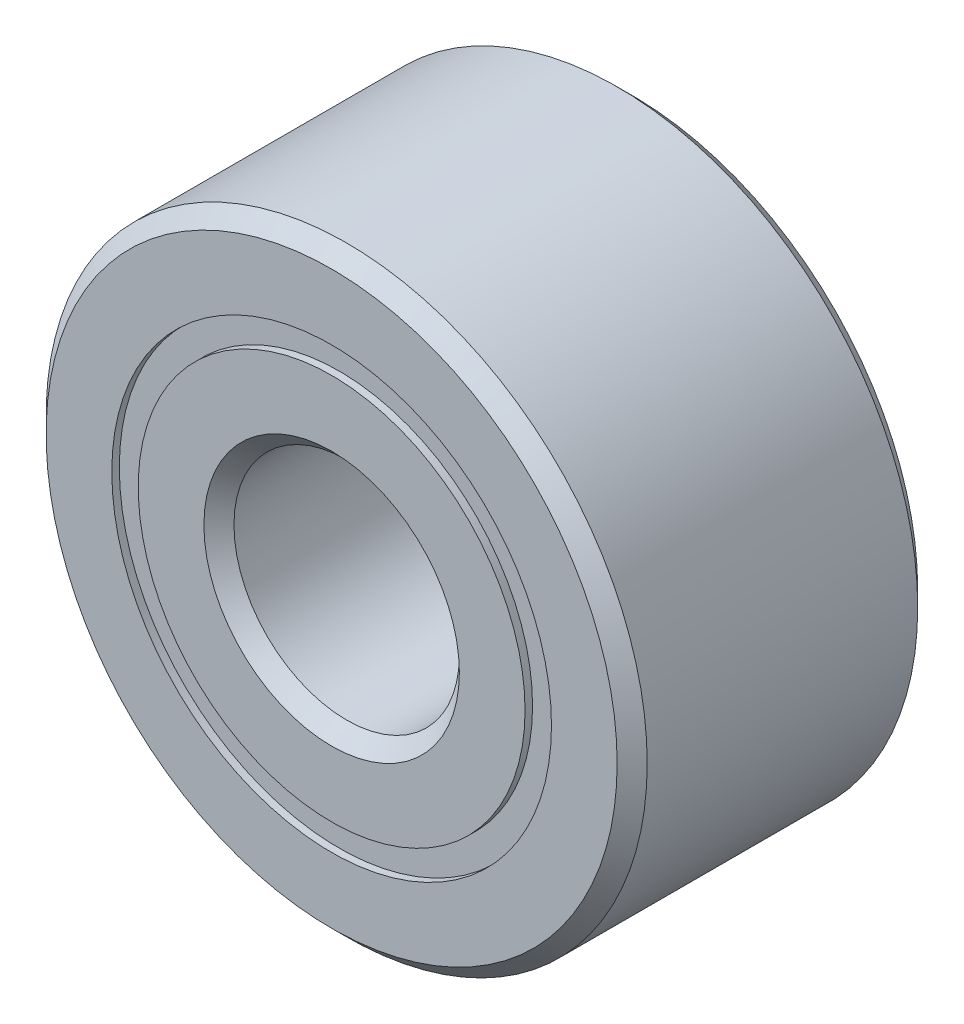
ISO-10303-21;
HEADER;
FILE_DESCRIPTION(('STEP AP214'),'2;1');
FILE_NAME('part.step','',(''),(''),'','','');
FILE_SCHEMA(('AUTOMOTIVE_DESIGN { 1 0 10303 214 1 1 1 1 }'));
ENDSEC;
DATA;
#1=APPLICATION_CONTEXT('core data for automotive mechanical design processes');
#2=APPLICATION_PROTOCOL_DEFINITION('international standard','automotive_design',2000,#1);
#3=PRODUCT_CONTEXT('',#1,'mechanical');
#4=PRODUCT('Part','Part','',(#3));
#5=PRODUCT_RELATED_PRODUCT_CATEGORY('part','',(#4));
#6=PRODUCT_DEFINITION_FORMATION('','',#4);
#7=PRODUCT_DEFINITION_CONTEXT('part definition',#1,'design');
#8=PRODUCT_DEFINITION('design','',#6,#7);
#9=PRODUCT_DEFINITION_SHAPE('','',#8);
#10=(LENGTH_UNIT() NAMED_UNIT(*) SI_UNIT(.MILLI.,.METRE.));
#11=(NAMED_UNIT(*) PLANE_ANGLE_UNIT() SI_UNIT($,.RADIAN.));
#12=(NAMED_UNIT(*) SI_UNIT($,.STERADIAN.) SOLID_ANGLE_UNIT());
#13=UNCERTAINTY_MEASURE_WITH_UNIT(LENGTH_MEASURE(1.E-05),#10,'distance_accuracy_value','');
#14=(GEOMETRIC_REPRESENTATION_CONTEXT(3) GLOBAL_UNCERTAINTY_ASSIGNED_CONTEXT((#13)) GLOBAL_UNIT_ASSIGNED_CONTEXT((#10,
#11,#12)) REPRESENTATION_CONTEXT('',''));
#15=CARTESIAN_POINT('',(0.,0.,0.));
#16=DIRECTION('',(0.,0.,1.));
#17=DIRECTION('',(1.,0.,0.));
#18=AXIS2_PLACEMENT_3D('',#15,#16,#17);
#19=CARTESIAN_POINT('',(0.,2.92582417582418,-1.9));
#20=DIRECTION('',(0.,0.,1.));
#21=DIRECTION('',(1.,0.,0.));
#22=AXIS2_PLACEMENT_3D('',#19,#20,#21);
#23=PLANE('',#22);
#24=CARTESIAN_POINT('',(0.,0.,-1.9));
#25=DIRECTION('',(0.,0.,1.));
#26=DIRECTION('',(1.,0.,0.));
#27=AXIS2_PLACEMENT_3D('',#24,#25,#26);
#28=CIRCLE('',#27,2.92582417582418);
#29=CARTESIAN_POINT('',(2.92582417582418,0.,-1.9));
#30=VERTEX_POINT('',#29);
#31=EDGE_CURVE('E55',#30,#30,#28,.T.);
#32=ORIENTED_EDGE('',*,*,#31,.F.);
#33=EDGE_LOOP('',(#32));
#34=FACE_BOUND('',#33,.T.);
#35=CARTESIAN_POINT('',(0.,0.,-1.9));
#36=DIRECTION('',(0.,0.,1.));
#37=DIRECTION('',(1.,0.,0.));
#38=AXIS2_PLACEMENT_3D('',#35,#36,#37);
#39=CIRCLE('',#38,2.57417582417583);
#40=CARTESIAN_POINT('',(2.57417582417583,0.,-1.9));
#41=VERTEX_POINT('',#40);
#42=EDGE_CURVE('E11',#41,#41,#39,.T.);
#43=ORIENTED_EDGE('',*,*,#42,.T.);
#44=EDGE_LOOP('',(#43));
#45=FACE_BOUND('',#44,.T.);
#46=ADVANCED_FACE('F41',(#34,#45),#23,.F.);
#47=CARTESIAN_POINT('',(0.,0.,2.));
#48=DIRECTION('',(0.,0.,1.));
#49=DIRECTION('',(1.,0.,0.));
#50=AXIS2_PLACEMENT_3D('',#47,#48,#49);
#51=CYLINDRICAL_SURFACE('',#50,2.57417582417583);
#52=ORIENTED_EDGE('',*,*,#42,.F.);
#53=EDGE_LOOP('',(#52));
#54=FACE_BOUND('',#53,.T.);
#55=CARTESIAN_POINT('',(0.,0.,-0.90611125012019));
#56=DIRECTION('',(0.,0.,1.));
#57=DIRECTION('',(1.,0.,0.));
#58=AXIS2_PLACEMENT_3D('',#55,#56,#57);
#59=CIRCLE('',#58,2.57417582417583);
#60=CARTESIAN_POINT('',(2.57417582417583,0.,-0.90611125012019));
#61=VERTEX_POINT('',#60);
#62=EDGE_CURVE('E47',#61,#61,#59,.T.);
#63=ORIENTED_EDGE('',*,*,#62,.T.);
#64=EDGE_LOOP('',(#63));
#65=FACE_BOUND('',#64,.T.);
#66=ADVANCED_FACE('F64',(#54,#65),#51,.F.);
#67=CARTESIAN_POINT('',(0.,2.92582417582418,-0.90611125012019));
#68=DIRECTION('',(0.,0.,-1.));
#69=DIRECTION('',(-1.,0.,0.));
#70=AXIS2_PLACEMENT_3D('',#67,#68,#69);
#71=PLANE('',#70);
#72=ORIENTED_EDGE('',*,*,#62,.F.);
#73=EDGE_LOOP('',(#72));
#74=FACE_BOUND('',#73,.T.);
#75=CARTESIAN_POINT('',(0.,0.,-0.90611125012019));
#76=DIRECTION('',(0.,0.,1.));
#77=DIRECTION('',(1.,0.,0.));
#78=AXIS2_PLACEMENT_3D('',#75,#76,#77);
#79=CIRCLE('',#78,2.92582417582418);
#80=CARTESIAN_POINT('',(2.92582417582418,0.,-0.90611125012019));
#81=VERTEX_POINT('',#80);
#82=EDGE_CURVE('E51',#81,#81,#79,.T.);
#83=ORIENTED_EDGE('',*,*,#82,.T.);
#84=EDGE_LOOP('',(#83));
#85=FACE_BOUND('',#84,.T.);
#86=ADVANCED_FACE('F68',(#74,#85),#71,.F.);
#87=CARTESIAN_POINT('',(0.,0.,2.));
#88=DIRECTION('',(0.,0.,1.));
#89=DIRECTION('',(1.,0.,0.));
#90=AXIS2_PLACEMENT_3D('',#87,#88,#89);
#91=CYLINDRICAL_SURFACE('',#90,2.92582417582418);
#92=ORIENTED_EDGE('',*,*,#82,.F.);
#93=EDGE_LOOP('',(#92));
#94=FACE_BOUND('',#93,.T.);
#95=ORIENTED_EDGE('',*,*,#31,.T.);
#96=EDGE_LOOP('',(#95));
#97=FACE_BOUND('',#96,.T.);
#98=ADVANCED_FACE('F61',(#94,#97),#91,.T.);
#99=CLOSED_SHELL('',(#46,#66,#86,#98));
#100=MANIFOLD_SOLID_BREP('B2',#99);
#101=CARTESIAN_POINT('',(0.,2.92582417582418,1.9));
#102=DIRECTION('',(0.,0.,-1.));
#103=DIRECTION('',(-1.,0.,0.));
#104=AXIS2_PLACEMENT_3D('',#101,#102,#103);
#105=PLANE('',#104);
#106=CARTESIAN_POINT('',(0.,0.,1.9));
#107=DIRECTION('',(0.,0.,1.));
#108=DIRECTION('',(1.,0.,0.));
#109=AXIS2_PLACEMENT_3D('',#106,#107,#108);
#110=CIRCLE('',#109,2.57417582417583);
#111=CARTESIAN_POINT('',(2.57417582417583,0.,1.9));
#112=VERTEX_POINT('',#111);
#113=EDGE_CURVE('E40',#112,#112,#110,.T.);
#114=ORIENTED_EDGE('',*,*,#113,.F.);
#115=EDGE_LOOP('',(#114));
#116=FACE_BOUND('',#115,.T.);
#117=CARTESIAN_POINT('',(0.,0.,1.9));
#118=DIRECTION('',(0.,0.,1.));
#119=DIRECTION('',(1.,0.,0.));
#120=AXIS2_PLACEMENT_3D('',#117,#118,#119);
#121=CIRCLE('',#120,2.92582417582418);
#122=CARTESIAN_POINT('',(2.92582417582418,0.,1.9));
#123=VERTEX_POINT('',#122);
#124=EDGE_CURVE('E122',#123,#123,#121,.T.);
#125=ORIENTED_EDGE('',*,*,#124,.T.);
#126=EDGE_LOOP('',(#125));
#127=FACE_BOUND('',#126,.T.);
#128=ADVANCED_FACE('F108',(#116,#127),#105,.F.);
#129=CARTESIAN_POINT('',(0.,0.,2.));
#130=DIRECTION('',(0.,0.,1.));
#131=DIRECTION('',(1.,0.,0.));
#132=AXIS2_PLACEMENT_3D('',#129,#130,#131);
#133=CYLINDRICAL_SURFACE('',#132,2.57417582417583);
#134=CARTESIAN_POINT('',(0.,0.,0.90611125012019));
#135=DIRECTION('',(0.,0.,1.));
#136=DIRECTION('',(1.,0.,0.));
#137=AXIS2_PLACEMENT_3D('',#134,#135,#136);
#138=CIRCLE('',#137,2.57417582417583);
#139=CARTESIAN_POINT('',(2.57417582417583,0.,0.90611125012019));
#140=VERTEX_POINT('',#139);
#141=EDGE_CURVE('E114',#140,#140,#138,.T.);
#142=ORIENTED_EDGE('',*,*,#141,.F.);
#143=EDGE_LOOP('',(#142));
#144=FACE_BOUND('',#143,.T.);
#145=ORIENTED_EDGE('',*,*,#113,.T.);
#146=EDGE_LOOP('',(#145));
#147=FACE_BOUND('',#146,.T.);
#148=ADVANCED_FACE('F137',(#144,#147),#133,.F.);
#149=CARTESIAN_POINT('',(0.,2.92582417582418,0.90611125012019));
#150=DIRECTION('',(0.,0.,1.));
#151=DIRECTION('',(1.,0.,0.));
#152=AXIS2_PLACEMENT_3D('',#149,#150,#151);
#153=PLANE('',#152);
#154=CARTESIAN_POINT('',(0.,0.,0.90611125012019));
#155=DIRECTION('',(0.,0.,1.));
#156=DIRECTION('',(1.,0.,0.));
#157=AXIS2_PLACEMENT_3D('',#154,#155,#156);
#158=CIRCLE('',#157,2.92582417582418);
#159=CARTESIAN_POINT('',(2.92582417582418,0.,0.90611125012019));
#160=VERTEX_POINT('',#159);
#161=EDGE_CURVE('E118',#160,#160,#158,.T.);
#162=ORIENTED_EDGE('',*,*,#161,.F.);
#163=EDGE_LOOP('',(#162));
#164=FACE_BOUND('',#163,.T.);
#165=ORIENTED_EDGE('',*,*,#141,.T.);
#166=EDGE_LOOP('',(#165));
#167=FACE_BOUND('',#166,.T.);
#168=ADVANCED_FACE('F132',(#164,#167),#153,.F.);
#169=CARTESIAN_POINT('',(0.,0.,2.));
#170=DIRECTION('',(0.,0.,1.));
#171=DIRECTION('',(1.,0.,0.));
#172=AXIS2_PLACEMENT_3D('',#169,#170,#171);
#173=CYLINDRICAL_SURFACE('',#172,2.92582417582418);
#174=ORIENTED_EDGE('',*,*,#124,.F.);
#175=EDGE_LOOP('',(#174));
#176=FACE_BOUND('',#175,.T.);
#177=ORIENTED_EDGE('',*,*,#161,.T.);
#178=EDGE_LOOP('',(#177));
#179=FACE_BOUND('',#178,.T.);
#180=ADVANCED_FACE('F129',(#176,#179),#173,.T.);
#181=CLOSED_SHELL('',(#128,#148,#168,#180));
#182=MANIFOLD_SOLID_BREP('B6',#181);
#183=CARTESIAN_POINT('',(-1.37499999999997,2.38156986040722,0.));
#184=DIRECTION('',(0.,0.,1.));
#185=DIRECTION('',(-0.499999999999989,0.866025403784445,0.));
#186=AXIS2_PLACEMENT_3D('',#183,#184,#185);
#187=SPHERICAL_SURFACE('',#186,0.90611125012019);
#188=CARTESIAN_POINT('',(-1.37499999999997,2.38156986040722,0.90611125012019));
#189=VERTEX_POINT('',#188);
#190=VERTEX_LOOP('',#189);
#191=FACE_BOUND('',#190,.T.);
#192=ADVANCED_FACE('F175',(#191),#187,.T.);
#193=CLOSED_SHELL('',(#192));
#194=MANIFOLD_SOLID_BREP('B35',#193);
#195=CARTESIAN_POINT('',(-2.38156986040719,1.37500000000003,0.));
#196=DIRECTION('',(0.,0.,1.));
#197=DIRECTION('',(-0.866025403784433,0.50000000000001,0.));
#198=AXIS2_PLACEMENT_3D('',#195,#196,#197);
#199=SPHERICAL_SURFACE('',#198,0.90611125012019);
#200=CARTESIAN_POINT('',(-2.38156986040719,1.37500000000003,0.90611125012019));
#201=VERTEX_POINT('',#200);
#202=VERTEX_LOOP('',#201);
#203=FACE_BOUND('',#202,.T.);
#204=ADVANCED_FACE('F195',(#203),#199,.T.);
#205=CLOSED_SHELL('',(#204));
#206=MANIFOLD_SOLID_BREP('B104',#205);
#207=CARTESIAN_POINT('',(-2.75,0.,0.));
#208=DIRECTION('',(0.,0.,1.));
#209=DIRECTION('',(-1.,0.,0.));
#210=AXIS2_PLACEMENT_3D('',#207,#208,#209);
#211=SPHERICAL_SURFACE('',#210,0.90611125012019);
#212=CARTESIAN_POINT('',(-2.75,0.,0.90611125012019));
#213=VERTEX_POINT('',#212);
#214=VERTEX_LOOP('',#213);
#215=FACE_BOUND('',#214,.T.);
#216=ADVANCED_FACE('F215',(#215),#211,.T.);
#217=CLOSED_SHELL('',(#216));
#218=MANIFOLD_SOLID_BREP('B171',#217);
#219=CARTESIAN_POINT('',(-2.38156986040722,-1.37499999999998,0.));
#220=DIRECTION('',(0.,0.,1.));
#221=DIRECTION('',(-0.866025403784443,-0.499999999999992,0.));
#222=AXIS2_PLACEMENT_3D('',#219,#220,#221);
#223=SPHERICAL_SURFACE('',#222,0.90611125012019);
#224=CARTESIAN_POINT('',(-2.38156986040722,-1.37499999999998,0.90611125012019));
#225=VERTEX_POINT('',#224);
#226=VERTEX_LOOP('',#225);
#227=FACE_BOUND('',#226,.T.);
#228=ADVANCED_FACE('F235',(#227),#223,.T.);
#229=CLOSED_SHELL('',(#228));
#230=MANIFOLD_SOLID_BREP('B191',#229);
#231=CARTESIAN_POINT('',(-1.37500000000002,-2.3815698604072,0.));
#232=DIRECTION('',(0.,0.,1.));
#233=DIRECTION('',(-0.500000000000007,-0.866025403784435,0.));
#234=AXIS2_PLACEMENT_3D('',#231,#232,#233);
#235=SPHERICAL_SURFACE('',#234,0.90611125012019);
#236=CARTESIAN_POINT('',(-1.37500000000002,-2.3815698604072,0.90611125012019));
#237=VERTEX_POINT('',#236);
#238=VERTEX_LOOP('',#237);
#239=FACE_BOUND('',#238,.T.);
#240=ADVANCED_FACE('F255',(#239),#235,.T.);
#241=CLOSED_SHELL('',(#240));
#242=MANIFOLD_SOLID_BREP('B211',#241);
#243=CARTESIAN_POINT('',(0.,-2.75,0.));
#244=DIRECTION('',(0.,0.,1.));
#245=DIRECTION('',(0.,-1.,0.));
#246=AXIS2_PLACEMENT_3D('',#243,#244,#245);
#247=SPHERICAL_SURFACE('',#246,0.90611125012019);
#248=CARTESIAN_POINT('',(0.,-2.75,0.90611125012019));
#249=VERTEX_POINT('',#248);
#250=VERTEX_LOOP('',#249);
#251=FACE_BOUND('',#250,.T.);
#252=ADVANCED_FACE('F275',(#251),#247,.T.);
#253=CLOSED_SHELL('',(#252));
#254=MANIFOLD_SOLID_BREP('B231',#253);
#255=CARTESIAN_POINT('',(1.37499999999999,-2.38156986040721,0.));
#256=DIRECTION('',(0.,0.,1.));
#257=DIRECTION('',(0.499999999999995,-0.866025403784442,0.));
#258=AXIS2_PLACEMENT_3D('',#255,#256,#257);
#259=SPHERICAL_SURFACE('',#258,0.90611125012019);
#260=CARTESIAN_POINT('',(1.37499999999999,-2.38156986040721,0.90611125012019));
#261=VERTEX_POINT('',#260);
#262=VERTEX_LOOP('',#261);
#263=FACE_BOUND('',#262,.T.);
#264=ADVANCED_FACE('F295',(#263),#259,.T.);
#265=CLOSED_SHELL('',(#264));
#266=MANIFOLD_SOLID_BREP('B251',#265);
#267=CARTESIAN_POINT('',(2.3815698604072,-1.37500000000001,0.));
#268=DIRECTION('',(0.,0.,1.));
#269=DIRECTION('',(0.866025403784436,-0.500000000000004,0.));
#270=AXIS2_PLACEMENT_3D('',#267,#268,#269);
#271=SPHERICAL_SURFACE('',#270,0.90611125012019);
#272=CARTESIAN_POINT('',(2.3815698604072,-1.37500000000001,0.90611125012019));
#273=VERTEX_POINT('',#272);
#274=VERTEX_LOOP('',#273);
#275=FACE_BOUND('',#274,.T.);
#276=ADVANCED_FACE('F315',(#275),#271,.T.);
#277=CLOSED_SHELL('',(#276));
#278=MANIFOLD_SOLID_BREP('B271',#277);
#279=CARTESIAN_POINT('',(2.75,0.,0.));
#280=DIRECTION('',(0.,0.,1.));
#281=DIRECTION('',(1.,0.,0.));
#282=AXIS2_PLACEMENT_3D('',#279,#280,#281);
#283=SPHERICAL_SURFACE('',#282,0.90611125012019);
#284=CARTESIAN_POINT('',(2.75,0.,0.90611125012019));
#285=VERTEX_POINT('',#284);
#286=VERTEX_LOOP('',#285);
#287=FACE_BOUND('',#286,.T.);
#288=ADVANCED_FACE('F335',(#287),#283,.T.);
#289=CLOSED_SHELL('',(#288));
#290=MANIFOLD_SOLID_BREP('B291',#289);
#291=CARTESIAN_POINT('',(2.38156986040721,1.37499999999999,0.));
#292=DIRECTION('',(0.,0.,1.));
#293=DIRECTION('',(0.86602540378444,0.499999999999998,0.));
#294=AXIS2_PLACEMENT_3D('',#291,#292,#293);
#295=SPHERICAL_SURFACE('',#294,0.90611125012019);
#296=CARTESIAN_POINT('',(2.38156986040721,1.37499999999999,0.90611125012019));
#297=VERTEX_POINT('',#296);
#298=VERTEX_LOOP('',#297);
#299=FACE_BOUND('',#298,.T.);
#300=ADVANCED_FACE('F355',(#299),#295,.T.);
#301=CLOSED_SHELL('',(#300));
#302=MANIFOLD_SOLID_BREP('B311',#301);
#303=CARTESIAN_POINT('',(1.375,2.3815698604072,0.));
#304=DIRECTION('',(0.,0.,1.));
#305=DIRECTION('',(0.500000000000001,0.866025403784438,0.));
#306=AXIS2_PLACEMENT_3D('',#303,#304,#305);
#307=SPHERICAL_SURFACE('',#306,0.90611125012019);
#308=CARTESIAN_POINT('',(1.375,2.3815698604072,0.90611125012019));
#309=VERTEX_POINT('',#308);
#310=VERTEX_LOOP('',#309);
#311=FACE_BOUND('',#310,.T.);
#312=ADVANCED_FACE('F375',(#311),#307,.T.);
#313=CLOSED_SHELL('',(#312));
#314=MANIFOLD_SOLID_BREP('B331',#313);
#315=CARTESIAN_POINT('',(0.,2.75,0.));
#316=DIRECTION('',(0.,0.,1.));
#317=DIRECTION('',(0.,1.,0.));
#318=AXIS2_PLACEMENT_3D('',#315,#316,#317);
#319=SPHERICAL_SURFACE('',#318,0.90611125012019);
#320=CARTESIAN_POINT('',(0.,2.75,0.90611125012019));
#321=VERTEX_POINT('',#320);
#322=VERTEX_LOOP('',#321);
#323=FACE_BOUND('',#322,.T.);
#324=ADVANCED_FACE('F397',(#323),#319,.T.);
#325=CLOSED_SHELL('',(#324));
#326=MANIFOLD_SOLID_BREP('B351',#325);
#327=CARTESIAN_POINT('',(0.,2.57417582417583,2.));
#328=DIRECTION('',(0.,0.,-1.));
#329=DIRECTION('',(-1.,0.,0.));
#330=AXIS2_PLACEMENT_3D('',#327,#328,#329);
#331=PLANE('',#330);
#332=CARTESIAN_POINT('',(0.,0.,2.));
#333=DIRECTION('',(0.,0.,1.));
#334=DIRECTION('',(1.,0.,0.));
#335=AXIS2_PLACEMENT_3D('',#332,#333,#334);
#336=CIRCLE('',#335,1.7);
#337=CARTESIAN_POINT('',(1.7,0.,2.));
#338=VERTEX_POINT('',#337);
#339=EDGE_CURVE('E444',#338,#338,#336,.T.);
#340=ORIENTED_EDGE('',*,*,#339,.F.);
#341=EDGE_LOOP('',(#340));
#342=FACE_BOUND('',#341,.T.);
#343=CARTESIAN_POINT('',(0.,0.,2.));
#344=DIRECTION('',(0.,0.,1.));
#345=DIRECTION('',(1.,0.,0.));
#346=AXIS2_PLACEMENT_3D('',#343,#344,#345);
#347=CIRCLE('',#346,2.57417582417583);
#348=CARTESIAN_POINT('',(2.57417582417583,0.,2.));
#349=VERTEX_POINT('',#348);
#350=EDGE_CURVE('E396',#349,#349,#347,.T.);
#351=ORIENTED_EDGE('',*,*,#350,.T.);
#352=EDGE_LOOP('',(#351));
#353=FACE_BOUND('',#352,.T.);
#354=ADVANCED_FACE('F416',(#342,#353),#331,.F.);
#355=CARTESIAN_POINT('',(0.,0.,2.));
#356=DIRECTION('',(0.,0.,1.));
#357=DIRECTION('',(1.,0.,0.));
#358=AXIS2_PLACEMENT_3D('',#355,#356,#357);
#359=CYLINDRICAL_SURFACE('',#358,2.57417582417583);
#360=ORIENTED_EDGE('',*,*,#350,.F.);
#361=EDGE_LOOP('',(#360));
#362=FACE_BOUND('',#361,.T.);
#363=CARTESIAN_POINT('',(0.,0.,0.888888888888889));
#364=DIRECTION('',(0.,0.,1.));
#365=DIRECTION('',(1.,0.,0.));
#366=AXIS2_PLACEMENT_3D('',#363,#364,#365);
#367=CIRCLE('',#366,2.57417582417583);
#368=CARTESIAN_POINT('',(2.57417582417583,0.,0.888888888888889));
#369=VERTEX_POINT('',#368);
#370=EDGE_CURVE('E422',#369,#369,#367,.T.);
#371=ORIENTED_EDGE('',*,*,#370,.T.);
#372=EDGE_LOOP('',(#371));
#373=FACE_BOUND('',#372,.T.);
#374=ADVANCED_FACE('F451',(#362,#373),#359,.T.);
#375=CARTESIAN_POINT('',(0.,0.,0.));
#376=DIRECTION('',(0.,0.,1.));
#377=DIRECTION('',(1.,0.,0.));
#378=AXIS2_PLACEMENT_3D('',#375,#376,#377);
#379=TOROIDAL_SURFACE('',#378,2.75,0.906111250120189);
#380=ORIENTED_EDGE('',*,*,#370,.F.);
#381=EDGE_LOOP('',(#380));
#382=FACE_BOUND('',#381,.T.);
#383=CARTESIAN_POINT('',(0.,0.,-0.88888888888889));
#384=DIRECTION('',(0.,0.,1.));
#385=DIRECTION('',(1.,0.,0.));
#386=AXIS2_PLACEMENT_3D('',#383,#384,#385);
#387=CIRCLE('',#386,2.57417582417583);
#388=CARTESIAN_POINT('',(2.57417582417583,0.,-0.88888888888889));
#389=VERTEX_POINT('',#388);
#390=EDGE_CURVE('E426',#389,#389,#387,.T.);
#391=ORIENTED_EDGE('',*,*,#390,.T.);
#392=EDGE_LOOP('',(#391));
#393=FACE_BOUND('',#392,.T.);
#394=ADVANCED_FACE('F455',(#382,#393),#379,.F.);
#395=CARTESIAN_POINT('',(0.,0.,2.));
#396=DIRECTION('',(0.,0.,1.));
#397=DIRECTION('',(1.,0.,0.));
#398=AXIS2_PLACEMENT_3D('',#395,#396,#397);
#399=CYLINDRICAL_SURFACE('',#398,2.57417582417583);
#400=ORIENTED_EDGE('',*,*,#390,.F.);
#401=EDGE_LOOP('',(#400));
#402=FACE_BOUND('',#401,.T.);
#403=CARTESIAN_POINT('',(0.,0.,-2.));
#404=DIRECTION('',(0.,0.,1.));
#405=DIRECTION('',(1.,0.,0.));
#406=AXIS2_PLACEMENT_3D('',#403,#404,#405);
#407=CIRCLE('',#406,2.57417582417583);
#408=CARTESIAN_POINT('',(2.57417582417583,0.,-2.));
#409=VERTEX_POINT('',#408);
#410=EDGE_CURVE('E430',#409,#409,#407,.T.);
#411=ORIENTED_EDGE('',*,*,#410,.T.);
#412=EDGE_LOOP('',(#411));
#413=FACE_BOUND('',#412,.T.);
#414=ADVANCED_FACE('F460',(#402,#413),#399,.T.);
#415=CARTESIAN_POINT('',(0.,1.7,-2.));
#416=DIRECTION('',(0.,0.,1.));
#417=DIRECTION('',(1.,0.,0.));
#418=AXIS2_PLACEMENT_3D('',#415,#416,#417);
#419=PLANE('',#418);
#420=ORIENTED_EDGE('',*,*,#410,.F.);
#421=EDGE_LOOP('',(#420));
#422=FACE_BOUND('',#421,.T.);
#423=CARTESIAN_POINT('',(0.,0.,-2.));
#424=DIRECTION('',(0.,0.,1.));
#425=DIRECTION('',(1.,0.,0.));
#426=AXIS2_PLACEMENT_3D('',#423,#424,#425);
#427=CIRCLE('',#426,1.7);
#428=CARTESIAN_POINT('',(1.7,0.,-2.));
#429=VERTEX_POINT('',#428);
#430=EDGE_CURVE('E435',#429,#429,#427,.T.);
#431=ORIENTED_EDGE('',*,*,#430,.T.);
#432=EDGE_LOOP('',(#431));
#433=FACE_BOUND('',#432,.T.);
#434=ADVANCED_FACE('F466',(#422,#433),#419,.F.);
#435=CARTESIAN_POINT('',(0.,0.,-1.8));
#436=DIRECTION('',(0.,0.,-1.));
#437=DIRECTION('',(-1.,0.,0.));
#438=AXIS2_PLACEMENT_3D('',#435,#436,#437);
#439=CONICAL_SURFACE('',#438,1.5,0.785398163397443);
#440=ORIENTED_EDGE('',*,*,#430,.F.);
#441=EDGE_LOOP('',(#440));
#442=FACE_BOUND('',#441,.T.);
#443=CARTESIAN_POINT('',(0.,0.,-1.8));
#444=DIRECTION('',(0.,0.,1.));
#445=DIRECTION('',(1.,0.,0.));
#446=AXIS2_PLACEMENT_3D('',#443,#444,#445);
#447=CIRCLE('',#446,1.5);
#448=CARTESIAN_POINT('',(1.5,0.,-1.8));
#449=VERTEX_POINT('',#448);
#450=EDGE_CURVE('E438',#449,#449,#447,.T.);
#451=ORIENTED_EDGE('',*,*,#450,.T.);
#452=EDGE_LOOP('',(#451));
#453=FACE_BOUND('',#452,.T.);
#454=ADVANCED_FACE('F470',(#442,#453),#439,.F.);
#455=CARTESIAN_POINT('',(0.,0.,2.));
#456=DIRECTION('',(0.,0.,1.));
#457=DIRECTION('',(1.,0.,0.));
#458=AXIS2_PLACEMENT_3D('',#455,#456,#457);
#459=CYLINDRICAL_SURFACE('',#458,1.5);
#460=ORIENTED_EDGE('',*,*,#450,.F.);
#461=EDGE_LOOP('',(#460));
#462=FACE_BOUND('',#461,.T.);
#463=CARTESIAN_POINT('',(0.,0.,1.8));
#464=DIRECTION('',(0.,0.,1.));
#465=DIRECTION('',(1.,0.,0.));
#466=AXIS2_PLACEMENT_3D('',#463,#464,#465);
#467=CIRCLE('',#466,1.5);
#468=CARTESIAN_POINT('',(1.5,0.,1.8));
#469=VERTEX_POINT('',#468);
#470=EDGE_CURVE('E441',#469,#469,#467,.T.);
#471=ORIENTED_EDGE('',*,*,#470,.T.);
#472=EDGE_LOOP('',(#471));
#473=FACE_BOUND('',#472,.T.);
#474=ADVANCED_FACE('F474',(#462,#473),#459,.F.);
#475=CARTESIAN_POINT('',(0.,0.,2.));
#476=DIRECTION('',(0.,0.,1.));
#477=DIRECTION('',(1.,0.,0.));
#478=AXIS2_PLACEMENT_3D('',#475,#476,#477);
#479=CONICAL_SURFACE('',#478,1.7,0.785398163397454);
#480=ORIENTED_EDGE('',*,*,#470,.F.);
#481=EDGE_LOOP('',(#480));
#482=FACE_BOUND('',#481,.T.);
#483=ORIENTED_EDGE('',*,*,#339,.T.);
#484=EDGE_LOOP('',(#483));
#485=FACE_BOUND('',#484,.T.);
#486=ADVANCED_FACE('F448',(#482,#485),#479,.F.);
#487=CLOSED_SHELL('',(#354,#374,#394,#414,#434,#454,#474,#486));
#488=MANIFOLD_SOLID_BREP('B371',#487);
#489=CARTESIAN_POINT('',(0.,0.,1.8));
#490=DIRECTION('',(0.,0.,-1.));
#491=DIRECTION('',(-1.,0.,0.));
#492=AXIS2_PLACEMENT_3D('',#489,#490,#491);
#493=CONICAL_SURFACE('',#492,4.,0.785398163397449);
#494=CARTESIAN_POINT('',(0.,0.,2.));
#495=DIRECTION('',(0.,0.,1.));
#496=DIRECTION('',(1.,0.,0.));
#497=AXIS2_PLACEMENT_3D('',#494,#495,#496);
#498=CIRCLE('',#497,3.8);
#499=CARTESIAN_POINT('',(3.8,0.,2.));
#500=VERTEX_POINT('',#499);
#501=EDGE_CURVE('E565',#500,#500,#498,.T.);
#502=ORIENTED_EDGE('',*,*,#501,.F.);
#503=EDGE_LOOP('',(#502));
#504=FACE_BOUND('',#503,.T.);
#505=CARTESIAN_POINT('',(0.,0.,1.8));
#506=DIRECTION('',(0.,0.,1.));
#507=DIRECTION('',(1.,0.,0.));
#508=AXIS2_PLACEMENT_3D('',#505,#506,#507);
#509=CIRCLE('',#508,4.);
#510=CARTESIAN_POINT('',(4.,0.,1.8));
#511=VERTEX_POINT('',#510);
#512=EDGE_CURVE('E415',#511,#511,#509,.T.);
#513=ORIENTED_EDGE('',*,*,#512,.T.);
#514=EDGE_LOOP('',(#513));
#515=FACE_BOUND('',#514,.T.);
#516=ADVANCED_FACE('F537',(#504,#515),#493,.T.);
#517=CARTESIAN_POINT('',(0.,0.,2.));
#518=DIRECTION('',(0.,0.,1.));
#519=DIRECTION('',(1.,0.,0.));
#520=AXIS2_PLACEMENT_3D('',#517,#518,#519);
#521=CYLINDRICAL_SURFACE('',#520,4.);
#522=ORIENTED_EDGE('',*,*,#512,.F.);
#523=EDGE_LOOP('',(#522));
#524=FACE_BOUND('',#523,.T.);
#525=CARTESIAN_POINT('',(0.,0.,-1.8));
#526=DIRECTION('',(0.,0.,1.));
#527=DIRECTION('',(1.,0.,0.));
#528=AXIS2_PLACEMENT_3D('',#525,#526,#527);
#529=CIRCLE('',#528,4.);
#530=CARTESIAN_POINT('',(4.,0.,-1.8));
#531=VERTEX_POINT('',#530);
#532=EDGE_CURVE('E543',#531,#531,#529,.T.);
#533=ORIENTED_EDGE('',*,*,#532,.T.);
#534=EDGE_LOOP('',(#533));
#535=FACE_BOUND('',#534,.T.);
#536=ADVANCED_FACE('F572',(#524,#535),#521,.T.);
#537=CARTESIAN_POINT('',(0.,0.,-2.));
#538=DIRECTION('',(0.,0.,1.));
#539=DIRECTION('',(1.,0.,0.));
#540=AXIS2_PLACEMENT_3D('',#537,#538,#539);
#541=CONICAL_SURFACE('',#540,3.8,0.785398163397452);
#542=ORIENTED_EDGE('',*,*,#532,.F.);
#543=EDGE_LOOP('',(#542));
#544=FACE_BOUND('',#543,.T.);
#545=CARTESIAN_POINT('',(0.,0.,-2.));
#546=DIRECTION('',(0.,0.,1.));
#547=DIRECTION('',(1.,0.,0.));
#548=AXIS2_PLACEMENT_3D('',#545,#546,#547);
#549=CIRCLE('',#548,3.8);
#550=CARTESIAN_POINT('',(3.8,0.,-2.));
#551=VERTEX_POINT('',#550);
#552=EDGE_CURVE('E547',#551,#551,#549,.T.);
#553=ORIENTED_EDGE('',*,*,#552,.T.);
#554=EDGE_LOOP('',(#553));
#555=FACE_BOUND('',#554,.T.);
#556=ADVANCED_FACE('F576',(#544,#555),#541,.T.);
#557=CARTESIAN_POINT('',(0.,3.8,-2.));
#558=DIRECTION('',(0.,0.,1.));
#559=DIRECTION('',(1.,0.,0.));
#560=AXIS2_PLACEMENT_3D('',#557,#558,#559);
#561=PLANE('',#560);
#562=ORIENTED_EDGE('',*,*,#552,.F.);
#563=EDGE_LOOP('',(#562));
#564=FACE_BOUND('',#563,.T.);
#565=CARTESIAN_POINT('',(0.,0.,-2.));
#566=DIRECTION('',(0.,0.,1.));
#567=DIRECTION('',(1.,0.,0.));
#568=AXIS2_PLACEMENT_3D('',#565,#566,#567);
#569=CIRCLE('',#568,2.92582417582418);
#570=CARTESIAN_POINT('',(2.92582417582418,0.,-2.));
#571=VERTEX_POINT('',#570);
#572=EDGE_CURVE('E551',#571,#571,#569,.T.);
#573=ORIENTED_EDGE('',*,*,#572,.T.);
#574=EDGE_LOOP('',(#573));
#575=FACE_BOUND('',#574,.T.);
#576=ADVANCED_FACE('F581',(#564,#575),#561,.F.);
#577=CARTESIAN_POINT('',(0.,0.,2.));
#578=DIRECTION('',(0.,0.,1.));
#579=DIRECTION('',(1.,0.,0.));
#580=AXIS2_PLACEMENT_3D('',#577,#578,#579);
#581=CYLINDRICAL_SURFACE('',#580,2.92582417582418);
#582=ORIENTED_EDGE('',*,*,#572,.F.);
#583=EDGE_LOOP('',(#582));
#584=FACE_BOUND('',#583,.T.);
#585=CARTESIAN_POINT('',(0.,0.,-0.888888888888889));
#586=DIRECTION('',(0.,0.,1.));
#587=DIRECTION('',(1.,0.,0.));
#588=AXIS2_PLACEMENT_3D('',#585,#586,#587);
#589=CIRCLE('',#588,2.92582417582418);
#590=CARTESIAN_POINT('',(2.92582417582418,0.,-0.888888888888889));
#591=VERTEX_POINT('',#590);
#592=EDGE_CURVE('E556',#591,#591,#589,.T.);
#593=ORIENTED_EDGE('',*,*,#592,.T.);
#594=EDGE_LOOP('',(#593));
#595=FACE_BOUND('',#594,.T.);
#596=ADVANCED_FACE('F587',(#584,#595),#581,.F.);
#597=CARTESIAN_POINT('',(0.,0.,0.));
#598=DIRECTION('',(0.,0.,1.));
#599=DIRECTION('',(1.,0.,0.));
#600=AXIS2_PLACEMENT_3D('',#597,#598,#599);
#601=TOROIDAL_SURFACE('',#600,2.75,0.90611125012019);
#602=ORIENTED_EDGE('',*,*,#592,.F.);
#603=EDGE_LOOP('',(#602));
#604=FACE_BOUND('',#603,.T.);
#605=CARTESIAN_POINT('',(0.,0.,0.888888888888889));
#606=DIRECTION('',(0.,0.,1.));
#607=DIRECTION('',(1.,0.,0.));
#608=AXIS2_PLACEMENT_3D('',#605,#606,#607);
#609=CIRCLE('',#608,2.92582417582418);
#610=CARTESIAN_POINT('',(2.92582417582418,0.,0.888888888888889));
#611=VERTEX_POINT('',#610);
#612=EDGE_CURVE('E559',#611,#611,#609,.T.);
#613=ORIENTED_EDGE('',*,*,#612,.T.);
#614=EDGE_LOOP('',(#613));
#615=FACE_BOUND('',#614,.T.);
#616=ADVANCED_FACE('F591',(#604,#615),#601,.F.);
#617=CARTESIAN_POINT('',(0.,0.,2.));
#618=DIRECTION('',(0.,0.,1.));
#619=DIRECTION('',(1.,0.,0.));
#620=AXIS2_PLACEMENT_3D('',#617,#618,#619);
#621=CYLINDRICAL_SURFACE('',#620,2.92582417582418);
#622=ORIENTED_EDGE('',*,*,#612,.F.);
#623=EDGE_LOOP('',(#622));
#624=FACE_BOUND('',#623,.T.);
#625=CARTESIAN_POINT('',(0.,0.,2.));
#626=DIRECTION('',(0.,0.,1.));
#627=DIRECTION('',(1.,0.,0.));
#628=AXIS2_PLACEMENT_3D('',#625,#626,#627);
#629=CIRCLE('',#628,2.92582417582418);
#630=CARTESIAN_POINT('',(2.92582417582418,0.,2.));
#631=VERTEX_POINT('',#630);
#632=EDGE_CURVE('E562',#631,#631,#629,.T.);
#633=ORIENTED_EDGE('',*,*,#632,.T.);
#634=EDGE_LOOP('',(#633));
#635=FACE_BOUND('',#634,.T.);
#636=ADVANCED_FACE('F595',(#624,#635),#621,.F.);
#637=CARTESIAN_POINT('',(0.,3.8,2.));
#638=DIRECTION('',(0.,0.,-1.));
#639=DIRECTION('',(-1.,0.,0.));
#640=AXIS2_PLACEMENT_3D('',#637,#638,#639);
#641=PLANE('',#640);
#642=ORIENTED_EDGE('',*,*,#632,.F.);
#643=EDGE_LOOP('',(#642));
#644=FACE_BOUND('',#643,.T.);
#645=ORIENTED_EDGE('',*,*,#501,.T.);
#646=EDGE_LOOP('',(#645));
#647=FACE_BOUND('',#646,.T.);
#648=ADVANCED_FACE('F569',(#644,#647),#641,.F.);
#649=CLOSED_SHELL('',(#516,#536,#556,#576,#596,#616,#636,#648));
#650=MANIFOLD_SOLID_BREP('B391',#649);
#651=ADVANCED_BREP_SHAPE_REPRESENTATION('',(#18,#100,#182,#194,#206,#218,#230,#242,#254,#266,
#278,#290,#302,#314,#326,#488,#650),#14);
#652=SHAPE_DEFINITION_REPRESENTATION(#9,#651);
ENDSEC;
END-ISO-10303-21;
